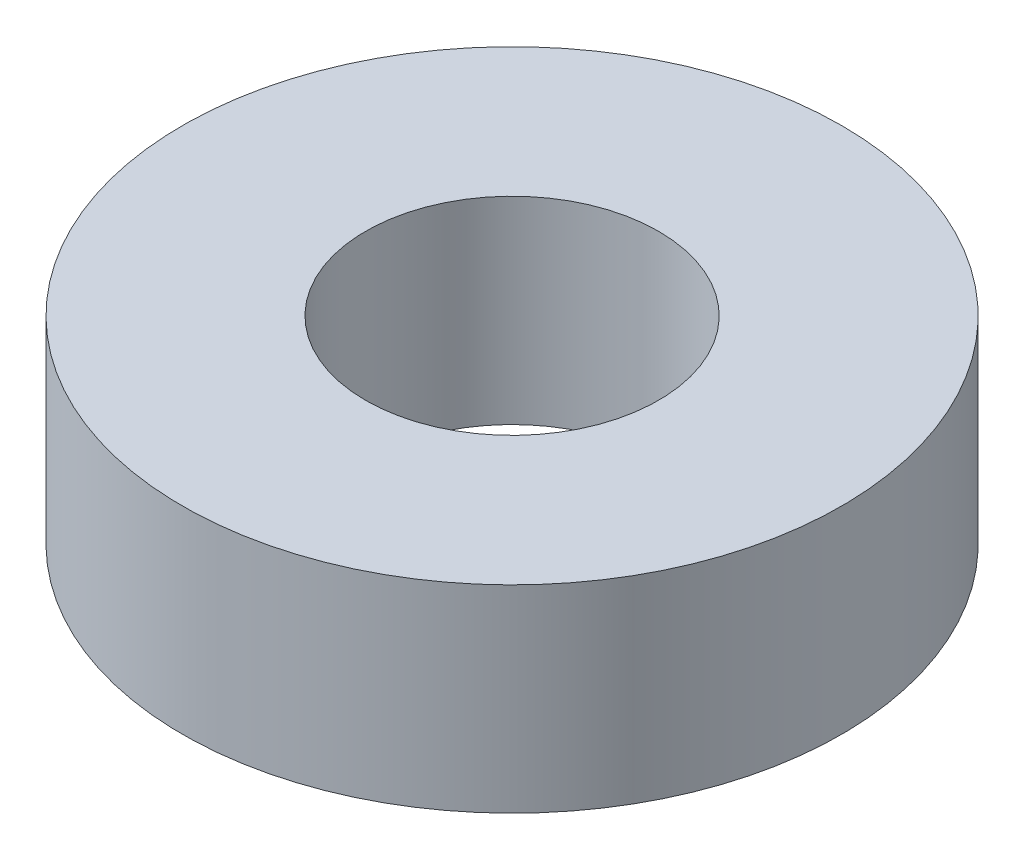
ISO-10303-21;
HEADER;
FILE_DESCRIPTION(('STEP AP214'),'2;1');
FILE_NAME('part.step','',(''),(''),'','','');
FILE_SCHEMA(('AUTOMOTIVE_DESIGN { 1 0 10303 214 1 1 1 1 }'));
ENDSEC;
DATA;
#1=APPLICATION_CONTEXT('core data for automotive mechanical design processes');
#2=APPLICATION_PROTOCOL_DEFINITION('international standard','automotive_design',2000,#1);
#3=PRODUCT_CONTEXT('',#1,'mechanical');
#4=PRODUCT('Part','Part','',(#3));
#5=PRODUCT_RELATED_PRODUCT_CATEGORY('part','',(#4));
#6=PRODUCT_DEFINITION_FORMATION('','',#4);
#7=PRODUCT_DEFINITION_CONTEXT('part definition',#1,'design');
#8=PRODUCT_DEFINITION('design','',#6,#7);
#9=PRODUCT_DEFINITION_SHAPE('','',#8);
#10=(LENGTH_UNIT() NAMED_UNIT(*) SI_UNIT(.MILLI.,.METRE.));
#11=(NAMED_UNIT(*) PLANE_ANGLE_UNIT() SI_UNIT($,.RADIAN.));
#12=(NAMED_UNIT(*) SI_UNIT($,.STERADIAN.) SOLID_ANGLE_UNIT());
#13=UNCERTAINTY_MEASURE_WITH_UNIT(LENGTH_MEASURE(1.E-05),#10,'distance_accuracy_value','');
#14=(GEOMETRIC_REPRESENTATION_CONTEXT(3) GLOBAL_UNCERTAINTY_ASSIGNED_CONTEXT((#13)) GLOBAL_UNIT_ASSIGNED_CONTEXT((#10,
#11,#12)) REPRESENTATION_CONTEXT('',''));
#15=CARTESIAN_POINT('',(0.,0.,0.));
#16=DIRECTION('',(0.,0.,1.));
#17=DIRECTION('',(1.,0.,0.));
#18=AXIS2_PLACEMENT_3D('',#15,#16,#17);
#19=CARTESIAN_POINT('',(0.,2.7,0.));
#20=DIRECTION('',(0.,1.,0.));
#21=DIRECTION('',(0.,0.,1.));
#22=AXIS2_PLACEMENT_3D('',#19,#20,#21);
#23=PLANE('',#22);
#24=CARTESIAN_POINT('',(0.,2.7,0.));
#25=DIRECTION('',(0.,1.,0.));
#26=DIRECTION('',(0.,0.,1.));
#27=AXIS2_PLACEMENT_3D('',#24,#25,#26);
#28=CIRCLE('',#27,4.5);
#29=CARTESIAN_POINT('',(0.,2.7,-4.5));
#30=VERTEX_POINT('',#29);
#31=EDGE_CURVE('E10',#30,#30,#28,.T.);
#32=ORIENTED_EDGE('',*,*,#31,.T.);
#33=EDGE_LOOP('',(#32));
#34=FACE_BOUND('',#33,.T.);
#35=CARTESIAN_POINT('',(0.,2.7,0.));
#36=DIRECTION('',(0.,1.,0.));
#37=DIRECTION('',(0.,0.,1.));
#38=AXIS2_PLACEMENT_3D('',#35,#36,#37);
#39=CIRCLE('',#38,2.);
#40=CARTESIAN_POINT('',(0.,2.7,-2.));
#41=VERTEX_POINT('',#40);
#42=EDGE_CURVE('E48',#41,#41,#39,.T.);
#43=ORIENTED_EDGE('',*,*,#42,.F.);
#44=EDGE_LOOP('',(#43));
#45=FACE_BOUND('',#44,.T.);
#46=ADVANCED_FACE('F40',(#34,#45),#23,.T.);
#47=CARTESIAN_POINT('',(0.,0.,0.));
#48=DIRECTION('',(0.,1.,0.));
#49=DIRECTION('',(0.,0.,1.));
#50=AXIS2_PLACEMENT_3D('',#47,#48,#49);
#51=PLANE('',#50);
#52=CARTESIAN_POINT('',(0.,0.,0.));
#53=DIRECTION('',(0.,1.,0.));
#54=DIRECTION('',(0.,0.,1.));
#55=AXIS2_PLACEMENT_3D('',#52,#53,#54);
#56=CIRCLE('',#55,4.5);
#57=CARTESIAN_POINT('',(0.,0.,-4.5));
#58=VERTEX_POINT('',#57);
#59=EDGE_CURVE('E41',#58,#58,#56,.T.);
#60=ORIENTED_EDGE('',*,*,#59,.F.);
#61=EDGE_LOOP('',(#60));
#62=FACE_BOUND('',#61,.T.);
#63=CARTESIAN_POINT('',(0.,0.,0.));
#64=DIRECTION('',(0.,1.,0.));
#65=DIRECTION('',(0.,0.,1.));
#66=AXIS2_PLACEMENT_3D('',#63,#64,#65);
#67=CIRCLE('',#66,2.);
#68=CARTESIAN_POINT('',(0.,0.,-2.));
#69=VERTEX_POINT('',#68);
#70=EDGE_CURVE('E49',#69,#69,#67,.T.);
#71=ORIENTED_EDGE('',*,*,#70,.T.);
#72=EDGE_LOOP('',(#71));
#73=FACE_BOUND('',#72,.T.);
#74=ADVANCED_FACE('F58',(#62,#73),#51,.F.);
#75=CARTESIAN_POINT('',(0.,2.7,0.));
#76=DIRECTION('',(0.,-1.,0.));
#77=DIRECTION('',(0.,0.,-1.));
#78=AXIS2_PLACEMENT_3D('',#75,#76,#77);
#79=CYLINDRICAL_SURFACE('',#78,4.5);
#80=CARTESIAN_POINT('',(0.,2.7,-4.5));
#81=CARTESIAN_POINT('',(0.,2.671875,-4.5));
#82=CARTESIAN_POINT('',(0.,2.64375,-4.5));
#83=CARTESIAN_POINT('',(0.,2.5875,-4.5));
#84=CARTESIAN_POINT('',(0.,2.559375,-4.5));
#85=CARTESIAN_POINT('',(0.,2.503125,-4.5));
#86=CARTESIAN_POINT('',(0.,2.475,-4.5));
#87=CARTESIAN_POINT('',(0.,2.41875,-4.5));
#88=CARTESIAN_POINT('',(0.,2.390625,-4.5));
#89=CARTESIAN_POINT('',(0.,2.334375,-4.5));
#90=CARTESIAN_POINT('',(0.,2.30625,-4.5));
#91=CARTESIAN_POINT('',(0.,2.25,-4.5));
#92=CARTESIAN_POINT('',(0.,2.221875,-4.5));
#93=CARTESIAN_POINT('',(0.,2.165625,-4.5));
#94=CARTESIAN_POINT('',(0.,2.1375,-4.5));
#95=CARTESIAN_POINT('',(0.,2.08125,-4.5));
#96=CARTESIAN_POINT('',(0.,2.053125,-4.5));
#97=CARTESIAN_POINT('',(0.,1.996875,-4.5));
#98=CARTESIAN_POINT('',(0.,1.96875,-4.5));
#99=CARTESIAN_POINT('',(0.,1.9125,-4.5));
#100=CARTESIAN_POINT('',(0.,1.884375,-4.5));
#101=CARTESIAN_POINT('',(0.,1.828125,-4.5));
#102=CARTESIAN_POINT('',(0.,1.8,-4.5));
#103=CARTESIAN_POINT('',(0.,1.74375,-4.5));
#104=CARTESIAN_POINT('',(0.,1.715625,-4.5));
#105=CARTESIAN_POINT('',(0.,1.659375,-4.5));
#106=CARTESIAN_POINT('',(0.,1.63125,-4.5));
#107=CARTESIAN_POINT('',(0.,1.575,-4.5));
#108=CARTESIAN_POINT('',(0.,1.546875,-4.5));
#109=CARTESIAN_POINT('',(0.,1.490625,-4.5));
#110=CARTESIAN_POINT('',(0.,1.4625,-4.5));
#111=CARTESIAN_POINT('',(0.,1.40625,-4.5));
#112=CARTESIAN_POINT('',(0.,1.378125,-4.5));
#113=CARTESIAN_POINT('',(0.,1.321875,-4.5));
#114=CARTESIAN_POINT('',(0.,1.29375,-4.5));
#115=CARTESIAN_POINT('',(0.,1.2375,-4.5));
#116=CARTESIAN_POINT('',(0.,1.209375,-4.5));
#117=CARTESIAN_POINT('',(0.,1.153125,-4.5));
#118=CARTESIAN_POINT('',(0.,1.125,-4.5));
#119=CARTESIAN_POINT('',(0.,1.06875,-4.5));
#120=CARTESIAN_POINT('',(0.,1.040625,-4.5));
#121=CARTESIAN_POINT('',(0.,0.984375,-4.5));
#122=CARTESIAN_POINT('',(0.,0.956249999999999,-4.5));
#123=CARTESIAN_POINT('',(0.,0.899999999999999,-4.5));
#124=CARTESIAN_POINT('',(0.,0.871875,-4.5));
#125=CARTESIAN_POINT('',(0.,0.815624999999999,-4.5));
#126=CARTESIAN_POINT('',(0.,0.787499999999999,-4.5));
#127=CARTESIAN_POINT('',(0.,0.73125,-4.5));
#128=CARTESIAN_POINT('',(0.,0.703125,-4.5));
#129=CARTESIAN_POINT('',(0.,0.646875,-4.5));
#130=CARTESIAN_POINT('',(0.,0.61875,-4.5));
#131=CARTESIAN_POINT('',(0.,0.5625,-4.5));
#132=CARTESIAN_POINT('',(0.,0.534375,-4.5));
#133=CARTESIAN_POINT('',(0.,0.478125,-4.5));
#134=CARTESIAN_POINT('',(0.,0.45,-4.5));
#135=CARTESIAN_POINT('',(0.,0.39375,-4.5));
#136=CARTESIAN_POINT('',(0.,0.365625,-4.5));
#137=CARTESIAN_POINT('',(0.,0.309375,-4.5));
#138=CARTESIAN_POINT('',(0.,0.28125,-4.5));
#139=CARTESIAN_POINT('',(0.,0.225,-4.5));
#140=CARTESIAN_POINT('',(0.,0.196875,-4.5));
#141=CARTESIAN_POINT('',(0.,0.140625,-4.5));
#142=CARTESIAN_POINT('',(0.,0.1125,-4.5));
#143=CARTESIAN_POINT('',(0.,0.0562499999999997,-4.5));
#144=CARTESIAN_POINT('',(0.,0.0281249999999996,-4.5));
#145=CARTESIAN_POINT('',(0.,0.,-4.5));
#146=B_SPLINE_CURVE_WITH_KNOTS('',3,(#80,#81,#82,#83,#84,#85,#86,#87,#88,#89,#90,#91,#92,#93,
#94,#95,#96,#97,#98,#99,#100,#101,#102,#103,#104,#105,#106,#107,#108,#109,#110,#111,#112,#113,
#114,#115,#116,#117,#118,#119,#120,#121,#122,#123,#124,#125,#126,#127,#128,#129,#130,#131,#132,
#133,#134,#135,#136,#137,#138,#139,#140,#141,#142,#143,#144,#145),.UNSPECIFIED.,.F.,.F.,(4,2,2,
2,2,2,2,2,2,2,2,2,2,2,2,2,2,2,2,2,2,2,2,2,2,2,2,2,2,2,2,2,4),(0.,0.0843750000000003,0.16875,
0.253125,0.3375,0.421875,0.50625,0.590625,0.675,0.759375,0.84375,0.928125000000001,1.0125,
1.096875,1.18125,1.265625,1.35,1.434375,1.51875,1.603125,1.6875,1.771875,1.85625,1.940625,2.025,
2.109375,2.19375,2.278125,2.3625,2.446875,2.53125,2.615625,2.7),.UNSPECIFIED.);
#147=EDGE_CURVE('BSEAM39',#30,#58,#146,.T.);
#148=ORIENTED_EDGE('',*,*,#31,.F.);
#149=ORIENTED_EDGE('',*,*,#59,.T.);
#150=ORIENTED_EDGE('',*,*,#147,.T.);
#151=ORIENTED_EDGE('',*,*,#147,.F.);
#152=EDGE_LOOP('',(#148,#150,#149,#151));
#153=FACE_BOUND('',#152,.T.);
#154=ADVANCED_FACE('F39',(#153),#79,.T.);
#155=CARTESIAN_POINT('',(0.,2.7,0.));
#156=DIRECTION('',(0.,-1.,0.));
#157=DIRECTION('',(0.,0.,-1.));
#158=AXIS2_PLACEMENT_3D('',#155,#156,#157);
#159=CYLINDRICAL_SURFACE('',#158,2.);
#160=CARTESIAN_POINT('',(0.,2.7,-2.));
#161=CARTESIAN_POINT('',(0.,2.671875,-2.));
#162=CARTESIAN_POINT('',(0.,2.64375,-2.));
#163=CARTESIAN_POINT('',(0.,2.5875,-2.));
#164=CARTESIAN_POINT('',(0.,2.559375,-2.));
#165=CARTESIAN_POINT('',(0.,2.503125,-2.));
#166=CARTESIAN_POINT('',(0.,2.475,-2.));
#167=CARTESIAN_POINT('',(0.,2.41875,-2.));
#168=CARTESIAN_POINT('',(0.,2.390625,-2.));
#169=CARTESIAN_POINT('',(0.,2.334375,-2.));
#170=CARTESIAN_POINT('',(0.,2.30625,-2.));
#171=CARTESIAN_POINT('',(0.,2.25,-2.));
#172=CARTESIAN_POINT('',(0.,2.221875,-2.));
#173=CARTESIAN_POINT('',(0.,2.165625,-2.));
#174=CARTESIAN_POINT('',(0.,2.1375,-2.));
#175=CARTESIAN_POINT('',(0.,2.08125,-2.));
#176=CARTESIAN_POINT('',(0.,2.053125,-2.));
#177=CARTESIAN_POINT('',(0.,1.996875,-2.));
#178=CARTESIAN_POINT('',(0.,1.96875,-2.));
#179=CARTESIAN_POINT('',(0.,1.9125,-2.));
#180=CARTESIAN_POINT('',(0.,1.884375,-2.));
#181=CARTESIAN_POINT('',(0.,1.828125,-2.));
#182=CARTESIAN_POINT('',(0.,1.8,-2.));
#183=CARTESIAN_POINT('',(0.,1.74375,-2.));
#184=CARTESIAN_POINT('',(0.,1.715625,-2.));
#185=CARTESIAN_POINT('',(0.,1.659375,-2.));
#186=CARTESIAN_POINT('',(0.,1.63125,-2.));
#187=CARTESIAN_POINT('',(0.,1.575,-2.));
#188=CARTESIAN_POINT('',(0.,1.546875,-2.));
#189=CARTESIAN_POINT('',(0.,1.490625,-2.));
#190=CARTESIAN_POINT('',(0.,1.4625,-2.));
#191=CARTESIAN_POINT('',(0.,1.40625,-2.));
#192=CARTESIAN_POINT('',(0.,1.378125,-2.));
#193=CARTESIAN_POINT('',(0.,1.321875,-2.));
#194=CARTESIAN_POINT('',(0.,1.29375,-2.));
#195=CARTESIAN_POINT('',(0.,1.2375,-2.));
#196=CARTESIAN_POINT('',(0.,1.209375,-2.));
#197=CARTESIAN_POINT('',(0.,1.153125,-2.));
#198=CARTESIAN_POINT('',(0.,1.125,-2.));
#199=CARTESIAN_POINT('',(0.,1.06875,-2.));
#200=CARTESIAN_POINT('',(0.,1.040625,-2.));
#201=CARTESIAN_POINT('',(0.,0.984375,-2.));
#202=CARTESIAN_POINT('',(0.,0.956249999999999,-2.));
#203=CARTESIAN_POINT('',(0.,0.899999999999999,-2.));
#204=CARTESIAN_POINT('',(0.,0.871875,-2.));
#205=CARTESIAN_POINT('',(0.,0.815624999999999,-2.));
#206=CARTESIAN_POINT('',(0.,0.787499999999999,-2.));
#207=CARTESIAN_POINT('',(0.,0.73125,-2.));
#208=CARTESIAN_POINT('',(0.,0.703125,-2.));
#209=CARTESIAN_POINT('',(0.,0.646875,-2.));
#210=CARTESIAN_POINT('',(0.,0.61875,-2.));
#211=CARTESIAN_POINT('',(0.,0.5625,-2.));
#212=CARTESIAN_POINT('',(0.,0.534375,-2.));
#213=CARTESIAN_POINT('',(0.,0.478125,-2.));
#214=CARTESIAN_POINT('',(0.,0.45,-2.));
#215=CARTESIAN_POINT('',(0.,0.39375,-2.));
#216=CARTESIAN_POINT('',(0.,0.365625,-2.));
#217=CARTESIAN_POINT('',(0.,0.309375,-2.));
#218=CARTESIAN_POINT('',(0.,0.28125,-2.));
#219=CARTESIAN_POINT('',(0.,0.225,-2.));
#220=CARTESIAN_POINT('',(0.,0.196875,-2.));
#221=CARTESIAN_POINT('',(0.,0.140625,-2.));
#222=CARTESIAN_POINT('',(0.,0.1125,-2.));
#223=CARTESIAN_POINT('',(0.,0.0562499999999997,-2.));
#224=CARTESIAN_POINT('',(0.,0.0281249999999996,-2.));
#225=CARTESIAN_POINT('',(0.,0.,-2.));
#226=B_SPLINE_CURVE_WITH_KNOTS('',3,(#160,#161,#162,#163,#164,#165,#166,#167,#168,#169,#170,
#171,#172,#173,#174,#175,#176,#177,#178,#179,#180,#181,#182,#183,#184,#185,#186,#187,#188,#189,
#190,#191,#192,#193,#194,#195,#196,#197,#198,#199,#200,#201,#202,#203,#204,#205,#206,#207,#208,
#209,#210,#211,#212,#213,#214,#215,#216,#217,#218,#219,#220,#221,#222,#223,#224,#225),
.UNSPECIFIED.,.F.,.F.,(4,2,2,2,2,2,2,2,2,2,2,2,2,2,2,2,2,2,2,2,2,2,2,2,2,2,2,2,2,2,2,2,4),(0.,
0.0843750000000003,0.16875,0.253125,0.3375,0.421875,0.50625,0.590625,0.675,0.759375,0.84375,
0.928125000000001,1.0125,1.096875,1.18125,1.265625,1.35,1.434375,1.51875,1.603125,1.6875,
1.771875,1.85625,1.940625,2.025,2.109375,2.19375,2.278125,2.3625,2.446875,2.53125,2.615625,2.7),.UNSPECIFIED.);
#227=EDGE_CURVE('BSEAM57',#41,#69,#226,.T.);
#228=ORIENTED_EDGE('',*,*,#42,.T.);
#229=ORIENTED_EDGE('',*,*,#70,.F.);
#230=ORIENTED_EDGE('',*,*,#227,.T.);
#231=ORIENTED_EDGE('',*,*,#227,.F.);
#232=EDGE_LOOP('',(#228,#230,#229,#231));
#233=FACE_BOUND('',#232,.T.);
#234=ADVANCED_FACE('F57',(#233),#159,.F.);
#235=CLOSED_SHELL('',(#46,#74,#154,#234));
#236=MANIFOLD_SOLID_BREP('B2',#235);
#237=ADVANCED_BREP_SHAPE_REPRESENTATION('',(#18,#236),#14);
#238=SHAPE_DEFINITION_REPRESENTATION(#9,#237);
ENDSEC;
END-ISO-10303-21;
